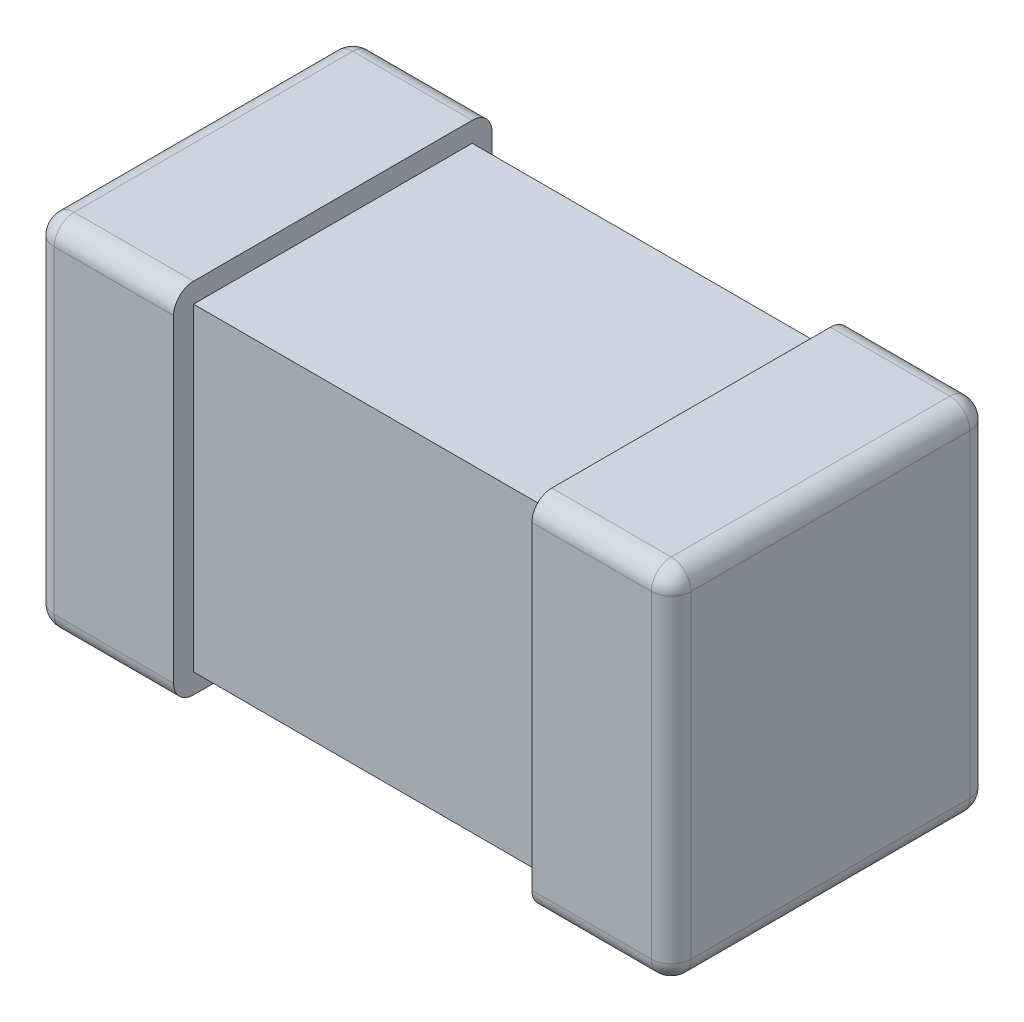
ISO-10303-21;
HEADER;
FILE_DESCRIPTION(('STEP AP214'),'2;1');
FILE_NAME('part.step','',(''),(''),'','','');
FILE_SCHEMA(('AUTOMOTIVE_DESIGN { 1 0 10303 214 1 1 1 1 }'));
ENDSEC;
DATA;
#1=APPLICATION_CONTEXT('core data for automotive mechanical design processes');
#2=APPLICATION_PROTOCOL_DEFINITION('international standard','automotive_design',2000,#1);
#3=PRODUCT_CONTEXT('',#1,'mechanical');
#4=PRODUCT('Part','Part','',(#3));
#5=PRODUCT_RELATED_PRODUCT_CATEGORY('part','',(#4));
#6=PRODUCT_DEFINITION_FORMATION('','',#4);
#7=PRODUCT_DEFINITION_CONTEXT('part definition',#1,'design');
#8=PRODUCT_DEFINITION('design','',#6,#7);
#9=PRODUCT_DEFINITION_SHAPE('','',#8);
#10=(LENGTH_UNIT() NAMED_UNIT(*) SI_UNIT(.MILLI.,.METRE.));
#11=(NAMED_UNIT(*) PLANE_ANGLE_UNIT() SI_UNIT($,.RADIAN.));
#12=(NAMED_UNIT(*) SI_UNIT($,.STERADIAN.) SOLID_ANGLE_UNIT());
#13=UNCERTAINTY_MEASURE_WITH_UNIT(LENGTH_MEASURE(1.E-05),#10,'distance_accuracy_value','');
#14=(GEOMETRIC_REPRESENTATION_CONTEXT(3) GLOBAL_UNCERTAINTY_ASSIGNED_CONTEXT((#13)) GLOBAL_UNIT_ASSIGNED_CONTEXT((#10,
#11,#12)) REPRESENTATION_CONTEXT('',''));
#15=CARTESIAN_POINT('',(0.,0.,0.));
#16=DIRECTION('',(0.,0.,1.));
#17=DIRECTION('',(1.,0.,0.));
#18=AXIS2_PLACEMENT_3D('',#15,#16,#17);
#19=CARTESIAN_POINT('',(-0.8,0.9,-0.4));
#20=DIRECTION('',(1.,0.,0.));
#21=DIRECTION('',(0.,0.,-1.));
#22=AXIS2_PLACEMENT_3D('',#19,#20,#21);
#23=PLANE('',#22);
#24=DIRECTION('',(0.,-1.,0.));
#25=VECTOR('',#24,1.);
#26=CARTESIAN_POINT('',(-0.8,0.9,-0.35));
#27=LINE('',#26,#25);
#28=CARTESIAN_POINT('',(-0.8,0.05,-0.35));
#29=VERTEX_POINT('',#28);
#30=CARTESIAN_POINT('',(-0.8,0.85,-0.35));
#31=VERTEX_POINT('',#30);
#32=EDGE_CURVE('E477',#29,#31,#27,.F.);
#33=ORIENTED_EDGE('',*,*,#32,.F.);
#34=DIRECTION('',(0.,0.,1.));
#35=VECTOR('',#34,1.);
#36=CARTESIAN_POINT('',(-0.8,0.05,-0.4));
#37=LINE('',#36,#35);
#38=CARTESIAN_POINT('',(-0.8,0.05,0.35));
#39=VERTEX_POINT('',#38);
#40=EDGE_CURVE('E476',#39,#29,#37,.F.);
#41=ORIENTED_EDGE('',*,*,#40,.F.);
#42=DIRECTION('',(0.,-1.,0.));
#43=VECTOR('',#42,1.);
#44=CARTESIAN_POINT('',(-0.8,0.9,0.35));
#45=LINE('',#44,#43);
#46=CARTESIAN_POINT('',(-0.8,0.85,0.35));
#47=VERTEX_POINT('',#46);
#48=EDGE_CURVE('E442',#47,#39,#45,.T.);
#49=ORIENTED_EDGE('',*,*,#48,.F.);
#50=DIRECTION('',(0.,0.,-1.));
#51=VECTOR('',#50,1.);
#52=CARTESIAN_POINT('',(-0.8,0.85,0.4));
#53=LINE('',#52,#51);
#54=EDGE_CURVE('E554',#31,#47,#53,.F.);
#55=ORIENTED_EDGE('',*,*,#54,.F.);
#56=EDGE_LOOP('',(#33,#41,#49,#55));
#57=FACE_BOUND('',#56,.T.);
#58=ADVANCED_FACE('F16',(#57),#23,.F.);
#59=CARTESIAN_POINT('',(0.8,0.9,-0.4));
#60=DIRECTION('',(-1.,0.,0.));
#61=DIRECTION('',(0.,0.,1.));
#62=AXIS2_PLACEMENT_3D('',#59,#60,#61);
#63=PLANE('',#62);
#64=DIRECTION('',(0.,-1.,0.));
#65=VECTOR('',#64,1.);
#66=CARTESIAN_POINT('',(0.8,0.9,0.35));
#67=LINE('',#66,#65);
#68=CARTESIAN_POINT('',(0.8,0.05,0.35));
#69=VERTEX_POINT('',#68);
#70=CARTESIAN_POINT('',(0.8,0.85,0.35));
#71=VERTEX_POINT('',#70);
#72=EDGE_CURVE('E375',#69,#71,#67,.F.);
#73=ORIENTED_EDGE('',*,*,#72,.F.);
#74=DIRECTION('',(0.,0.,-1.));
#75=VECTOR('',#74,1.);
#76=CARTESIAN_POINT('',(0.8,0.05,-0.4));
#77=LINE('',#76,#75);
#78=CARTESIAN_POINT('',(0.8,0.05,-0.35));
#79=VERTEX_POINT('',#78);
#80=EDGE_CURVE('E374',#79,#69,#77,.F.);
#81=ORIENTED_EDGE('',*,*,#80,.F.);
#82=DIRECTION('',(0.,-1.,0.));
#83=VECTOR('',#82,1.);
#84=CARTESIAN_POINT('',(0.8,0.9,-0.35));
#85=LINE('',#84,#83);
#86=CARTESIAN_POINT('',(0.8,0.85,-0.35));
#87=VERTEX_POINT('',#86);
#88=EDGE_CURVE('E336',#87,#79,#85,.T.);
#89=ORIENTED_EDGE('',*,*,#88,.F.);
#90=DIRECTION('',(0.,0.,1.));
#91=VECTOR('',#90,1.);
#92=CARTESIAN_POINT('',(0.8,0.85,0.400000000000001));
#93=LINE('',#92,#91);
#94=EDGE_CURVE('E532',#71,#87,#93,.F.);
#95=ORIENTED_EDGE('',*,*,#94,.F.);
#96=EDGE_LOOP('',(#73,#81,#89,#95));
#97=FACE_BOUND('',#96,.T.);
#98=ADVANCED_FACE('F509',(#97),#63,.F.);
#99=CARTESIAN_POINT('',(-0.75,0.85,0.35));
#100=DIRECTION('',(1.,0.,0.));
#101=DIRECTION('',(0.,0.,-1.));
#102=AXIS2_PLACEMENT_3D('',#99,#100,#101);
#103=SPHERICAL_SURFACE('',#102,0.05);
#104=CARTESIAN_POINT('',(-0.75,0.85,0.35));
#105=DIRECTION('',(-1.,0.,0.));
#106=DIRECTION('',(0.,0.,1.));
#107=AXIS2_PLACEMENT_3D('',#104,#105,#106);
#108=CIRCLE('',#107,0.05);
#109=CARTESIAN_POINT('',(-0.75,0.9,0.35));
#110=VERTEX_POINT('',#109);
#111=CARTESIAN_POINT('',(-0.75,0.85,0.4));
#112=VERTEX_POINT('',#111);
#113=EDGE_CURVE('E434',#110,#112,#108,.F.);
#114=ORIENTED_EDGE('',*,*,#113,.F.);
#115=CARTESIAN_POINT('',(-0.75,0.85,0.35));
#116=DIRECTION('',(0.,0.,-1.));
#117=DIRECTION('',(-1.,0.,0.));
#118=AXIS2_PLACEMENT_3D('',#115,#116,#117);
#119=CIRCLE('',#118,0.05);
#120=EDGE_CURVE('E557',#47,#110,#119,.T.);
#121=ORIENTED_EDGE('',*,*,#120,.F.);
#122=CARTESIAN_POINT('',(-0.75,0.85,0.35));
#123=DIRECTION('',(0.,-1.,0.));
#124=DIRECTION('',(0.,0.,-1.));
#125=AXIS2_PLACEMENT_3D('',#122,#123,#124);
#126=CIRCLE('',#125,0.05);
#127=EDGE_CURVE('E430',#112,#47,#126,.T.);
#128=ORIENTED_EDGE('',*,*,#127,.F.);
#129=EDGE_LOOP('',(#114,#121,#128));
#130=FACE_BOUND('',#129,.T.);
#131=ADVANCED_FACE('F505',(#130),#103,.T.);
#132=CARTESIAN_POINT('',(-0.75,0.85,0.4));
#133=DIRECTION('',(0.,0.,-1.));
#134=DIRECTION('',(-1.,0.,0.));
#135=AXIS2_PLACEMENT_3D('',#132,#133,#134);
#136=CYLINDRICAL_SURFACE('',#135,0.05);
#137=CARTESIAN_POINT('',(-0.75,0.85,-0.35));
#138=DIRECTION('',(0.,3.83299520255585E-12,1.));
#139=DIRECTION('',(1.,0.,0.));
#140=AXIS2_PLACEMENT_3D('',#137,#138,#139);
#141=CIRCLE('',#140,0.05);
#142=CARTESIAN_POINT('',(-0.75,0.9,-0.350000000000048));
#143=VERTEX_POINT('',#142);
#144=EDGE_CURVE('E483',#31,#143,#141,.F.);
#145=ORIENTED_EDGE('',*,*,#144,.F.);
#146=ORIENTED_EDGE('',*,*,#54,.T.);
#147=ORIENTED_EDGE('',*,*,#120,.T.);
#148=DIRECTION('',(0.,0.,1.));
#149=VECTOR('',#148,1.);
#150=CARTESIAN_POINT('',(-0.75,0.9,0.4));
#151=LINE('',#150,#149);
#152=EDGE_CURVE('E186',#143,#110,#151,.T.);
#153=ORIENTED_EDGE('',*,*,#152,.F.);
#154=EDGE_LOOP('',(#145,#146,#147,#153));
#155=FACE_BOUND('',#154,.T.);
#156=ADVANCED_FACE('F501',(#155),#136,.T.);
#157=CARTESIAN_POINT('',(-0.75,0.85,-0.35));
#158=DIRECTION('',(1.,0.,0.));
#159=DIRECTION('',(0.,0.,-1.));
#160=AXIS2_PLACEMENT_3D('',#157,#158,#159);
#161=SPHERICAL_SURFACE('',#160,0.05);
#162=CARTESIAN_POINT('',(-0.75,0.85,-0.35));
#163=DIRECTION('',(1.,0.,0.));
#164=DIRECTION('',(0.,0.,-1.));
#165=AXIS2_PLACEMENT_3D('',#162,#163,#164);
#166=CIRCLE('',#165,0.05);
#167=CARTESIAN_POINT('',(-0.75,0.85,-0.4));
#168=VERTEX_POINT('',#167);
#169=EDGE_CURVE('E190',#168,#143,#166,.T.);
#170=ORIENTED_EDGE('',*,*,#169,.F.);
#171=CARTESIAN_POINT('',(-0.75,0.85,-0.35));
#172=DIRECTION('',(0.,-1.,0.));
#173=DIRECTION('',(0.,0.,-1.));
#174=AXIS2_PLACEMENT_3D('',#171,#172,#173);
#175=CIRCLE('',#174,0.05);
#176=EDGE_CURVE('E480',#31,#168,#175,.T.);
#177=ORIENTED_EDGE('',*,*,#176,.F.);
#178=ORIENTED_EDGE('',*,*,#144,.T.);
#179=EDGE_LOOP('',(#170,#177,#178));
#180=FACE_BOUND('',#179,.T.);
#181=ADVANCED_FACE('F498',(#180),#161,.T.);
#182=CARTESIAN_POINT('',(-0.75,0.9,-0.35));
#183=DIRECTION('',(0.,-1.,0.));
#184=DIRECTION('',(0.,0.,-1.));
#185=AXIS2_PLACEMENT_3D('',#182,#183,#184);
#186=CYLINDRICAL_SURFACE('',#185,0.05);
#187=CARTESIAN_POINT('',(-0.75,0.05,-0.35));
#188=DIRECTION('',(0.,1.,0.));
#189=DIRECTION('',(1.,0.,0.));
#190=AXIS2_PLACEMENT_3D('',#187,#188,#189);
#191=CIRCLE('',#190,0.05);
#192=CARTESIAN_POINT('',(-0.75,0.05,-0.4));
#193=VERTEX_POINT('',#192);
#194=EDGE_CURVE('E473',#29,#193,#191,.F.);
#195=ORIENTED_EDGE('',*,*,#194,.F.);
#196=ORIENTED_EDGE('',*,*,#32,.T.);
#197=ORIENTED_EDGE('',*,*,#176,.T.);
#198=DIRECTION('',(0.,1.,0.));
#199=VECTOR('',#198,1.);
#200=CARTESIAN_POINT('',(-0.75,0.9,-0.4));
#201=LINE('',#200,#199);
#202=EDGE_CURVE('E304',#168,#193,#201,.F.);
#203=ORIENTED_EDGE('',*,*,#202,.T.);
#204=EDGE_LOOP('',(#195,#196,#197,#203));
#205=FACE_BOUND('',#204,.T.);
#206=ADVANCED_FACE('F465',(#205),#186,.T.);
#207=CARTESIAN_POINT('',(-0.75,0.05,-0.35));
#208=DIRECTION('',(1.,0.,0.));
#209=DIRECTION('',(0.,0.,-1.));
#210=AXIS2_PLACEMENT_3D('',#207,#208,#209);
#211=SPHERICAL_SURFACE('',#210,0.05);
#212=CARTESIAN_POINT('',(-0.75,0.05,-0.35));
#213=DIRECTION('',(0.,0.,1.));
#214=DIRECTION('',(1.,0.,0.));
#215=AXIS2_PLACEMENT_3D('',#212,#213,#214);
#216=CIRCLE('',#215,0.05);
#217=CARTESIAN_POINT('',(-0.75,0.,-0.35));
#218=VERTEX_POINT('',#217);
#219=EDGE_CURVE('E546',#29,#218,#216,.T.);
#220=ORIENTED_EDGE('',*,*,#219,.F.);
#221=ORIENTED_EDGE('',*,*,#194,.T.);
#222=CARTESIAN_POINT('',(-0.75,0.05,-0.35));
#223=DIRECTION('',(-1.,0.,0.));
#224=DIRECTION('',(0.,0.,1.));
#225=AXIS2_PLACEMENT_3D('',#222,#223,#224);
#226=CIRCLE('',#225,0.05);
#227=EDGE_CURVE('E297',#218,#193,#226,.F.);
#228=ORIENTED_EDGE('',*,*,#227,.F.);
#229=EDGE_LOOP('',(#220,#221,#228));
#230=FACE_BOUND('',#229,.T.);
#231=ADVANCED_FACE('F460',(#230),#211,.T.);
#232=CARTESIAN_POINT('',(-0.75,0.05,-0.4));
#233=DIRECTION('',(0.,0.,1.));
#234=DIRECTION('',(1.,0.,0.));
#235=AXIS2_PLACEMENT_3D('',#232,#233,#234);
#236=CYLINDRICAL_SURFACE('',#235,0.05);
#237=ORIENTED_EDGE('',*,*,#219,.T.);
#238=DIRECTION('',(0.,0.,1.));
#239=VECTOR('',#238,1.);
#240=CARTESIAN_POINT('',(-0.75,0.,0.4));
#241=LINE('',#240,#239);
#242=CARTESIAN_POINT('',(-0.75,0.,0.35));
#243=VERTEX_POINT('',#242);
#244=EDGE_CURVE('E291',#218,#243,#241,.T.);
#245=ORIENTED_EDGE('',*,*,#244,.T.);
#246=CARTESIAN_POINT('',(-0.75,0.05,0.35));
#247=DIRECTION('',(0.,0.,-1.));
#248=DIRECTION('',(1.,0.,0.));
#249=AXIS2_PLACEMENT_3D('',#246,#247,#248);
#250=CIRCLE('',#249,0.05);
#251=EDGE_CURVE('E431',#39,#243,#250,.F.);
#252=ORIENTED_EDGE('',*,*,#251,.F.);
#253=ORIENTED_EDGE('',*,*,#40,.T.);
#254=EDGE_LOOP('',(#237,#245,#252,#253));
#255=FACE_BOUND('',#254,.T.);
#256=ADVANCED_FACE('F456',(#255),#236,.T.);
#257=CARTESIAN_POINT('',(-0.75,0.05,0.35));
#258=DIRECTION('',(1.,0.,0.));
#259=DIRECTION('',(0.,0.,-1.));
#260=AXIS2_PLACEMENT_3D('',#257,#258,#259);
#261=SPHERICAL_SURFACE('',#260,0.05);
#262=CARTESIAN_POINT('',(-0.75,0.05,0.35));
#263=DIRECTION('',(0.,-1.,0.));
#264=DIRECTION('',(0.,0.,-1.));
#265=AXIS2_PLACEMENT_3D('',#262,#263,#264);
#266=CIRCLE('',#265,0.05);
#267=CARTESIAN_POINT('',(-0.75,0.05,0.4));
#268=VERTEX_POINT('',#267);
#269=EDGE_CURVE('E427',#39,#268,#266,.F.);
#270=ORIENTED_EDGE('',*,*,#269,.F.);
#271=ORIENTED_EDGE('',*,*,#251,.T.);
#272=CARTESIAN_POINT('',(-0.75,0.05,0.35));
#273=DIRECTION('',(1.,0.,0.));
#274=DIRECTION('',(0.,0.,-1.));
#275=AXIS2_PLACEMENT_3D('',#272,#273,#274);
#276=CIRCLE('',#275,0.05);
#277=EDGE_CURVE('E284',#268,#243,#276,.T.);
#278=ORIENTED_EDGE('',*,*,#277,.F.);
#279=EDGE_LOOP('',(#270,#271,#278));
#280=FACE_BOUND('',#279,.T.);
#281=ADVANCED_FACE('F453',(#280),#261,.T.);
#282=CARTESIAN_POINT('',(-0.75,0.9,0.35));
#283=DIRECTION('',(0.,-1.,0.));
#284=DIRECTION('',(0.,0.,-1.));
#285=AXIS2_PLACEMENT_3D('',#282,#283,#284);
#286=CYLINDRICAL_SURFACE('',#285,0.05);
#287=ORIENTED_EDGE('',*,*,#127,.T.);
#288=ORIENTED_EDGE('',*,*,#48,.T.);
#289=ORIENTED_EDGE('',*,*,#269,.T.);
#290=DIRECTION('',(0.,1.,0.));
#291=VECTOR('',#290,1.);
#292=CARTESIAN_POINT('',(-0.75,0.9,0.4));
#293=LINE('',#292,#291);
#294=EDGE_CURVE('E274',#268,#112,#293,.T.);
#295=ORIENTED_EDGE('',*,*,#294,.T.);
#296=EDGE_LOOP('',(#287,#288,#289,#295));
#297=FACE_BOUND('',#296,.T.);
#298=ADVANCED_FACE('F409',(#297),#286,.T.);
#299=CARTESIAN_POINT('',(0.75,0.85,-0.35));
#300=DIRECTION('',(1.,0.,0.));
#301=DIRECTION('',(0.,0.,-1.));
#302=AXIS2_PLACEMENT_3D('',#299,#300,#301);
#303=SPHERICAL_SURFACE('',#302,0.05);
#304=CARTESIAN_POINT('',(0.75,0.85,-0.35));
#305=DIRECTION('',(1.,0.,0.));
#306=DIRECTION('',(0.,0.,-1.));
#307=AXIS2_PLACEMENT_3D('',#304,#305,#306);
#308=CIRCLE('',#307,0.05);
#309=CARTESIAN_POINT('',(0.75,0.9,-0.35));
#310=VERTEX_POINT('',#309);
#311=CARTESIAN_POINT('',(0.75,0.85,-0.4));
#312=VERTEX_POINT('',#311);
#313=EDGE_CURVE('E328',#310,#312,#308,.F.);
#314=ORIENTED_EDGE('',*,*,#313,.F.);
#315=CARTESIAN_POINT('',(0.75,0.85,-0.35));
#316=DIRECTION('',(0.,0.,1.));
#317=DIRECTION('',(1.,0.,0.));
#318=AXIS2_PLACEMENT_3D('',#315,#316,#317);
#319=CIRCLE('',#318,0.05);
#320=EDGE_CURVE('E535',#87,#310,#319,.T.);
#321=ORIENTED_EDGE('',*,*,#320,.F.);
#322=CARTESIAN_POINT('',(0.75,0.85,-0.35));
#323=DIRECTION('',(0.,-1.,0.));
#324=DIRECTION('',(0.,0.,-1.));
#325=AXIS2_PLACEMENT_3D('',#322,#323,#324);
#326=CIRCLE('',#325,0.05);
#327=EDGE_CURVE('E324',#312,#87,#326,.T.);
#328=ORIENTED_EDGE('',*,*,#327,.F.);
#329=EDGE_LOOP('',(#314,#321,#328));
#330=FACE_BOUND('',#329,.T.);
#331=ADVANCED_FACE('F404',(#330),#303,.T.);
#332=CARTESIAN_POINT('',(0.75,0.85,0.400000000000001));
#333=DIRECTION('',(0.,0.,1.));
#334=DIRECTION('',(1.,0.,0.));
#335=AXIS2_PLACEMENT_3D('',#332,#333,#334);
#336=CYLINDRICAL_SURFACE('',#335,0.05);
#337=CARTESIAN_POINT('',(0.75,0.85,0.35));
#338=DIRECTION('',(0.,-3.83309478248086E-12,1.));
#339=DIRECTION('',(1.,0.,0.));
#340=AXIS2_PLACEMENT_3D('',#337,#338,#339);
#341=CIRCLE('',#340,0.05);
#342=CARTESIAN_POINT('',(0.75,0.9,0.350000000000048));
#343=VERTEX_POINT('',#342);
#344=EDGE_CURVE('E381',#71,#343,#341,.T.);
#345=ORIENTED_EDGE('',*,*,#344,.F.);
#346=ORIENTED_EDGE('',*,*,#94,.T.);
#347=ORIENTED_EDGE('',*,*,#320,.T.);
#348=DIRECTION('',(0.,0.,1.));
#349=VECTOR('',#348,1.);
#350=CARTESIAN_POINT('',(0.75,0.9,0.4));
#351=LINE('',#350,#349);
#352=EDGE_CURVE('E267',#343,#310,#351,.F.);
#353=ORIENTED_EDGE('',*,*,#352,.F.);
#354=EDGE_LOOP('',(#345,#346,#347,#353));
#355=FACE_BOUND('',#354,.T.);
#356=ADVANCED_FACE('F400',(#355),#336,.T.);
#357=CARTESIAN_POINT('',(0.75,0.85,0.35));
#358=DIRECTION('',(1.,0.,0.));
#359=DIRECTION('',(0.,0.,-1.));
#360=AXIS2_PLACEMENT_3D('',#357,#358,#359);
#361=SPHERICAL_SURFACE('',#360,0.05);
#362=CARTESIAN_POINT('',(0.75,0.85,0.35));
#363=DIRECTION('',(-1.,0.,0.));
#364=DIRECTION('',(0.,0.,1.));
#365=AXIS2_PLACEMENT_3D('',#362,#363,#364);
#366=CIRCLE('',#365,0.05);
#367=CARTESIAN_POINT('',(0.75,0.85,0.4));
#368=VERTEX_POINT('',#367);
#369=EDGE_CURVE('E261',#368,#343,#366,.T.);
#370=ORIENTED_EDGE('',*,*,#369,.F.);
#371=CARTESIAN_POINT('',(0.75,0.85,0.35));
#372=DIRECTION('',(0.,-1.,0.));
#373=DIRECTION('',(0.,0.,-1.));
#374=AXIS2_PLACEMENT_3D('',#371,#372,#373);
#375=CIRCLE('',#374,0.05);
#376=EDGE_CURVE('E378',#71,#368,#375,.T.);
#377=ORIENTED_EDGE('',*,*,#376,.F.);
#378=ORIENTED_EDGE('',*,*,#344,.T.);
#379=EDGE_LOOP('',(#370,#377,#378));
#380=FACE_BOUND('',#379,.T.);
#381=ADVANCED_FACE('F397',(#380),#361,.T.);
#382=CARTESIAN_POINT('',(0.75,0.9,0.35));
#383=DIRECTION('',(0.,-1.,0.));
#384=DIRECTION('',(0.,0.,-1.));
#385=AXIS2_PLACEMENT_3D('',#382,#383,#384);
#386=CYLINDRICAL_SURFACE('',#385,0.05);
#387=CARTESIAN_POINT('',(0.75,0.05,0.35));
#388=DIRECTION('',(0.,-1.,1.43719514775472E-12));
#389=DIRECTION('',(1.,0.,0.));
#390=AXIS2_PLACEMENT_3D('',#387,#388,#389);
#391=CIRCLE('',#390,0.05);
#392=CARTESIAN_POINT('',(0.75,0.050000000000018,0.4));
#393=VERTEX_POINT('',#392);
#394=EDGE_CURVE('E371',#69,#393,#391,.T.);
#395=ORIENTED_EDGE('',*,*,#394,.F.);
#396=ORIENTED_EDGE('',*,*,#72,.T.);
#397=ORIENTED_EDGE('',*,*,#376,.T.);
#398=DIRECTION('',(0.,1.,0.));
#399=VECTOR('',#398,1.);
#400=CARTESIAN_POINT('',(0.75,0.9,0.4));
#401=LINE('',#400,#399);
#402=EDGE_CURVE('E255',#368,#393,#401,.F.);
#403=ORIENTED_EDGE('',*,*,#402,.T.);
#404=EDGE_LOOP('',(#395,#396,#397,#403));
#405=FACE_BOUND('',#404,.T.);
#406=ADVANCED_FACE('F363',(#405),#386,.T.);
#407=CARTESIAN_POINT('',(0.75,0.05,0.35));
#408=DIRECTION('',(1.,0.,0.));
#409=DIRECTION('',(0.,0.,-1.));
#410=AXIS2_PLACEMENT_3D('',#407,#408,#409);
#411=SPHERICAL_SURFACE('',#410,0.05);
#412=CARTESIAN_POINT('',(0.75,0.05,0.35));
#413=DIRECTION('',(0.,0.,-1.));
#414=DIRECTION('',(-1.,0.,0.));
#415=AXIS2_PLACEMENT_3D('',#412,#413,#414);
#416=CIRCLE('',#415,0.05);
#417=CARTESIAN_POINT('',(0.75,0.,0.35));
#418=VERTEX_POINT('',#417);
#419=EDGE_CURVE('E524',#69,#418,#416,.T.);
#420=ORIENTED_EDGE('',*,*,#419,.F.);
#421=ORIENTED_EDGE('',*,*,#394,.T.);
#422=CARTESIAN_POINT('',(0.75,0.05,0.35));
#423=DIRECTION('',(1.,0.,0.));
#424=DIRECTION('',(0.,0.,-1.));
#425=AXIS2_PLACEMENT_3D('',#422,#423,#424);
#426=CIRCLE('',#425,0.05);
#427=EDGE_CURVE('E248',#418,#393,#426,.F.);
#428=ORIENTED_EDGE('',*,*,#427,.F.);
#429=EDGE_LOOP('',(#420,#421,#428));
#430=FACE_BOUND('',#429,.T.);
#431=ADVANCED_FACE('F358',(#430),#411,.T.);
#432=CARTESIAN_POINT('',(0.75,0.05,-0.4));
#433=DIRECTION('',(0.,0.,-1.));
#434=DIRECTION('',(-1.,0.,0.));
#435=AXIS2_PLACEMENT_3D('',#432,#433,#434);
#436=CYLINDRICAL_SURFACE('',#435,0.05);
#437=ORIENTED_EDGE('',*,*,#419,.T.);
#438=DIRECTION('',(0.,0.,1.));
#439=VECTOR('',#438,1.);
#440=CARTESIAN_POINT('',(0.75,0.,0.4));
#441=LINE('',#440,#439);
#442=CARTESIAN_POINT('',(0.75,0.,-0.35));
#443=VERTEX_POINT('',#442);
#444=EDGE_CURVE('E242',#418,#443,#441,.F.);
#445=ORIENTED_EDGE('',*,*,#444,.T.);
#446=CARTESIAN_POINT('',(0.75,0.05,-0.35));
#447=DIRECTION('',(0.,0.,-1.));
#448=DIRECTION('',(1.,0.,0.));
#449=AXIS2_PLACEMENT_3D('',#446,#447,#448);
#450=CIRCLE('',#449,0.05);
#451=EDGE_CURVE('E325',#79,#443,#450,.T.);
#452=ORIENTED_EDGE('',*,*,#451,.F.);
#453=ORIENTED_EDGE('',*,*,#80,.T.);
#454=EDGE_LOOP('',(#437,#445,#452,#453));
#455=FACE_BOUND('',#454,.T.);
#456=ADVANCED_FACE('F353',(#455),#436,.T.);
#457=CARTESIAN_POINT('',(0.75,0.05,-0.35));
#458=DIRECTION('',(1.,0.,0.));
#459=DIRECTION('',(0.,0.,-1.));
#460=AXIS2_PLACEMENT_3D('',#457,#458,#459);
#461=SPHERICAL_SURFACE('',#460,0.05);
#462=CARTESIAN_POINT('',(0.75,0.05,-0.35));
#463=DIRECTION('',(0.,-1.,0.));
#464=DIRECTION('',(0.,0.,-1.));
#465=AXIS2_PLACEMENT_3D('',#462,#463,#464);
#466=CIRCLE('',#465,0.05);
#467=CARTESIAN_POINT('',(0.75,0.05,-0.4));
#468=VERTEX_POINT('',#467);
#469=EDGE_CURVE('E321',#79,#468,#466,.F.);
#470=ORIENTED_EDGE('',*,*,#469,.F.);
#471=ORIENTED_EDGE('',*,*,#451,.T.);
#472=CARTESIAN_POINT('',(0.75,0.05,-0.35));
#473=DIRECTION('',(-1.,0.,0.));
#474=DIRECTION('',(0.,0.,1.));
#475=AXIS2_PLACEMENT_3D('',#472,#473,#474);
#476=CIRCLE('',#475,0.05);
#477=EDGE_CURVE('E235',#468,#443,#476,.T.);
#478=ORIENTED_EDGE('',*,*,#477,.F.);
#479=EDGE_LOOP('',(#470,#471,#478));
#480=FACE_BOUND('',#479,.T.);
#481=ADVANCED_FACE('F348',(#480),#461,.T.);
#482=CARTESIAN_POINT('',(0.75,0.9,-0.35));
#483=DIRECTION('',(0.,-1.,0.));
#484=DIRECTION('',(0.,0.,-1.));
#485=AXIS2_PLACEMENT_3D('',#482,#483,#484);
#486=CYLINDRICAL_SURFACE('',#485,0.05);
#487=ORIENTED_EDGE('',*,*,#327,.T.);
#488=ORIENTED_EDGE('',*,*,#88,.T.);
#489=ORIENTED_EDGE('',*,*,#469,.T.);
#490=DIRECTION('',(0.,1.,0.));
#491=VECTOR('',#490,1.);
#492=CARTESIAN_POINT('',(0.75,0.9,-0.4));
#493=LINE('',#492,#491);
#494=EDGE_CURVE('E210',#468,#312,#493,.T.);
#495=ORIENTED_EDGE('',*,*,#494,.T.);
#496=EDGE_LOOP('',(#487,#488,#489,#495));
#497=FACE_BOUND('',#496,.T.);
#498=ADVANCED_FACE('F352',(#497),#486,.T.);
#499=CARTESIAN_POINT('',(-0.8,0.85,0.35));
#500=DIRECTION('',(-1.,0.,0.));
#501=DIRECTION('',(0.,0.,1.));
#502=AXIS2_PLACEMENT_3D('',#499,#500,#501);
#503=CYLINDRICAL_SURFACE('',#502,0.05);
#504=ORIENTED_EDGE('',*,*,#113,.T.);
#505=DIRECTION('',(-1.,0.,0.));
#506=VECTOR('',#505,1.);
#507=CARTESIAN_POINT('',(-0.8,0.85,0.4));
#508=LINE('',#507,#506);
#509=CARTESIAN_POINT('',(-0.45,0.85,0.4));
#510=VERTEX_POINT('',#509);
#511=EDGE_CURVE('E203',#112,#510,#508,.F.);
#512=ORIENTED_EDGE('',*,*,#511,.T.);
#513=CARTESIAN_POINT('',(-0.45,0.85,0.35));
#514=DIRECTION('',(-1.,0.,0.));
#515=DIRECTION('',(0.,0.,1.));
#516=AXIS2_PLACEMENT_3D('',#513,#514,#515);
#517=CIRCLE('',#516,0.05);
#518=CARTESIAN_POINT('',(-0.45,0.9,0.35));
#519=VERTEX_POINT('',#518);
#520=EDGE_CURVE('E19',#510,#519,#517,.T.);
#521=ORIENTED_EDGE('',*,*,#520,.T.);
#522=DIRECTION('',(1.,0.,0.));
#523=VECTOR('',#522,1.);
#524=CARTESIAN_POINT('',(-0.8,0.9,0.35));
#525=LINE('',#524,#523);
#526=EDGE_CURVE('E181',#110,#519,#525,.T.);
#527=ORIENTED_EDGE('',*,*,#526,.F.);
#528=EDGE_LOOP('',(#504,#512,#521,#527));
#529=FACE_BOUND('',#528,.T.);
#530=ADVANCED_FACE('F201',(#529),#503,.T.);
#531=CARTESIAN_POINT('',(-0.8,0.9,0.4));
#532=DIRECTION('',(0.,1.,0.));
#533=DIRECTION('',(0.,0.,1.));
#534=AXIS2_PLACEMENT_3D('',#531,#532,#533);
#535=PLANE('',#534);
#536=DIRECTION('',(0.,0.,1.));
#537=VECTOR('',#536,1.);
#538=CARTESIAN_POINT('',(-0.45,0.9,-0.4));
#539=LINE('',#538,#537);
#540=CARTESIAN_POINT('',(-0.45,0.9,-0.35));
#541=VERTEX_POINT('',#540);
#542=EDGE_CURVE('E184',#519,#541,#539,.F.);
#543=ORIENTED_EDGE('',*,*,#542,.T.);
#544=DIRECTION('',(1.,0.,0.));
#545=VECTOR('',#544,1.);
#546=CARTESIAN_POINT('',(-0.8,0.9,-0.35));
#547=LINE('',#546,#545);
#548=EDGE_CURVE('E305',#143,#541,#547,.T.);
#549=ORIENTED_EDGE('',*,*,#548,.F.);
#550=ORIENTED_EDGE('',*,*,#152,.T.);
#551=ORIENTED_EDGE('',*,*,#526,.T.);
#552=EDGE_LOOP('',(#543,#549,#550,#551));
#553=FACE_BOUND('',#552,.T.);
#554=ADVANCED_FACE('F182',(#553),#535,.T.);
#555=CARTESIAN_POINT('',(-0.8,0.85,-0.35));
#556=DIRECTION('',(1.,0.,0.));
#557=DIRECTION('',(0.,0.,-1.));
#558=AXIS2_PLACEMENT_3D('',#555,#556,#557);
#559=CYLINDRICAL_SURFACE('',#558,0.05);
#560=ORIENTED_EDGE('',*,*,#169,.T.);
#561=ORIENTED_EDGE('',*,*,#548,.T.);
#562=CARTESIAN_POINT('',(-0.45,0.85,-0.35));
#563=DIRECTION('',(1.,0.,0.));
#564=DIRECTION('',(0.,0.,-1.));
#565=AXIS2_PLACEMENT_3D('',#562,#563,#564);
#566=CIRCLE('',#565,0.05);
#567=CARTESIAN_POINT('',(-0.45,0.85,-0.4));
#568=VERTEX_POINT('',#567);
#569=EDGE_CURVE('E198',#541,#568,#566,.F.);
#570=ORIENTED_EDGE('',*,*,#569,.T.);
#571=DIRECTION('',(1.,0.,0.));
#572=VECTOR('',#571,1.);
#573=CARTESIAN_POINT('',(-0.8,0.85,-0.4));
#574=LINE('',#573,#572);
#575=EDGE_CURVE('E300',#568,#168,#574,.F.);
#576=ORIENTED_EDGE('',*,*,#575,.T.);
#577=EDGE_LOOP('',(#560,#561,#570,#576));
#578=FACE_BOUND('',#577,.T.);
#579=ADVANCED_FACE('F727',(#578),#559,.T.);
#580=CARTESIAN_POINT('',(-0.8,0.9,-0.4));
#581=DIRECTION('',(0.,0.,1.));
#582=DIRECTION('',(1.,0.,0.));
#583=AXIS2_PLACEMENT_3D('',#580,#581,#582);
#584=PLANE('',#583);
#585=ORIENTED_EDGE('',*,*,#575,.F.);
#586=DIRECTION('',(0.,1.,0.));
#587=VECTOR('',#586,1.);
#588=CARTESIAN_POINT('',(-0.45,0.,-0.4));
#589=LINE('',#588,#587);
#590=CARTESIAN_POINT('',(-0.45,0.05,-0.4));
#591=VERTEX_POINT('',#590);
#592=EDGE_CURVE('E590',#568,#591,#589,.F.);
#593=ORIENTED_EDGE('',*,*,#592,.T.);
#594=DIRECTION('',(-1.,0.,0.));
#595=VECTOR('',#594,1.);
#596=CARTESIAN_POINT('',(-0.8,0.05,-0.4));
#597=LINE('',#596,#595);
#598=EDGE_CURVE('E292',#193,#591,#597,.F.);
#599=ORIENTED_EDGE('',*,*,#598,.F.);
#600=ORIENTED_EDGE('',*,*,#202,.F.);
#601=EDGE_LOOP('',(#585,#593,#599,#600));
#602=FACE_BOUND('',#601,.T.);
#603=ADVANCED_FACE('F723',(#602),#584,.F.);
#604=CARTESIAN_POINT('',(-0.8,0.05,-0.35));
#605=DIRECTION('',(-1.,0.,0.));
#606=DIRECTION('',(0.,0.,1.));
#607=AXIS2_PLACEMENT_3D('',#604,#605,#606);
#608=CYLINDRICAL_SURFACE('',#607,0.05);
#609=ORIENTED_EDGE('',*,*,#227,.T.);
#610=ORIENTED_EDGE('',*,*,#598,.T.);
#611=CARTESIAN_POINT('',(-0.45,0.05,-0.35));
#612=DIRECTION('',(-1.,0.,0.));
#613=DIRECTION('',(0.,0.,1.));
#614=AXIS2_PLACEMENT_3D('',#611,#612,#613);
#615=CIRCLE('',#614,0.05);
#616=CARTESIAN_POINT('',(-0.45,0.,-0.35));
#617=VERTEX_POINT('',#616);
#618=EDGE_CURVE('E587',#591,#617,#615,.T.);
#619=ORIENTED_EDGE('',*,*,#618,.T.);
#620=DIRECTION('',(1.,0.,0.));
#621=VECTOR('',#620,1.);
#622=CARTESIAN_POINT('',(-0.8,0.,-0.35));
#623=LINE('',#622,#621);
#624=EDGE_CURVE('E287',#617,#218,#623,.F.);
#625=ORIENTED_EDGE('',*,*,#624,.T.);
#626=EDGE_LOOP('',(#609,#610,#619,#625));
#627=FACE_BOUND('',#626,.T.);
#628=ADVANCED_FACE('F719',(#627),#608,.T.);
#629=CARTESIAN_POINT('',(-0.8,0.,0.4));
#630=DIRECTION('',(0.,1.,0.));
#631=DIRECTION('',(0.,0.,1.));
#632=AXIS2_PLACEMENT_3D('',#629,#630,#631);
#633=PLANE('',#632);
#634=DIRECTION('',(1.,0.,0.));
#635=VECTOR('',#634,1.);
#636=CARTESIAN_POINT('',(-0.8,0.,0.35));
#637=LINE('',#636,#635);
#638=CARTESIAN_POINT('',(-0.45,0.,0.35));
#639=VERTEX_POINT('',#638);
#640=EDGE_CURVE('E279',#243,#639,#637,.T.);
#641=ORIENTED_EDGE('',*,*,#640,.F.);
#642=ORIENTED_EDGE('',*,*,#244,.F.);
#643=ORIENTED_EDGE('',*,*,#624,.F.);
#644=DIRECTION('',(0.,0.,1.));
#645=VECTOR('',#644,1.);
#646=CARTESIAN_POINT('',(-0.45,0.,-0.4));
#647=LINE('',#646,#645);
#648=EDGE_CURVE('E586',#617,#639,#647,.T.);
#649=ORIENTED_EDGE('',*,*,#648,.T.);
#650=EDGE_LOOP('',(#641,#642,#643,#649));
#651=FACE_BOUND('',#650,.T.);
#652=ADVANCED_FACE('F715',(#651),#633,.F.);
#653=CARTESIAN_POINT('',(-0.8,0.05,0.35));
#654=DIRECTION('',(1.,0.,0.));
#655=DIRECTION('',(0.,0.,-1.));
#656=AXIS2_PLACEMENT_3D('',#653,#654,#655);
#657=CYLINDRICAL_SURFACE('',#656,0.05);
#658=ORIENTED_EDGE('',*,*,#277,.T.);
#659=ORIENTED_EDGE('',*,*,#640,.T.);
#660=CARTESIAN_POINT('',(-0.45,0.05,0.35));
#661=DIRECTION('',(1.,0.,0.));
#662=DIRECTION('',(0.,0.,-1.));
#663=AXIS2_PLACEMENT_3D('',#660,#661,#662);
#664=CIRCLE('',#663,0.05);
#665=CARTESIAN_POINT('',(-0.45,0.05,0.4));
#666=VERTEX_POINT('',#665);
#667=EDGE_CURVE('E581',#639,#666,#664,.F.);
#668=ORIENTED_EDGE('',*,*,#667,.T.);
#669=DIRECTION('',(-1.,0.,0.));
#670=VECTOR('',#669,1.);
#671=CARTESIAN_POINT('',(-0.8,0.05,0.4));
#672=LINE('',#671,#670);
#673=EDGE_CURVE('E270',#666,#268,#672,.T.);
#674=ORIENTED_EDGE('',*,*,#673,.T.);
#675=EDGE_LOOP('',(#658,#659,#668,#674));
#676=FACE_BOUND('',#675,.T.);
#677=ADVANCED_FACE('F711',(#676),#657,.T.);
#678=CARTESIAN_POINT('',(-0.8,0.9,0.4));
#679=DIRECTION('',(0.,0.,-1.));
#680=DIRECTION('',(-1.,0.,0.));
#681=AXIS2_PLACEMENT_3D('',#678,#679,#680);
#682=PLANE('',#681);
#683=ORIENTED_EDGE('',*,*,#673,.F.);
#684=DIRECTION('',(0.,1.,0.));
#685=VECTOR('',#684,1.);
#686=CARTESIAN_POINT('',(-0.45,0.,0.4));
#687=LINE('',#686,#685);
#688=EDGE_CURVE('E585',#666,#510,#687,.T.);
#689=ORIENTED_EDGE('',*,*,#688,.T.);
#690=ORIENTED_EDGE('',*,*,#511,.F.);
#691=ORIENTED_EDGE('',*,*,#294,.F.);
#692=EDGE_LOOP('',(#683,#689,#690,#691));
#693=FACE_BOUND('',#692,.T.);
#694=ADVANCED_FACE('F707',(#693),#682,.F.);
#695=CARTESIAN_POINT('',(-0.8,0.85,-0.35));
#696=DIRECTION('',(1.,0.,0.));
#697=DIRECTION('',(0.,0.,-1.));
#698=AXIS2_PLACEMENT_3D('',#695,#696,#697);
#699=CYLINDRICAL_SURFACE('',#698,0.05);
#700=ORIENTED_EDGE('',*,*,#313,.T.);
#701=DIRECTION('',(1.,0.,0.));
#702=VECTOR('',#701,1.);
#703=CARTESIAN_POINT('',(-0.8,0.85,-0.4));
#704=LINE('',#703,#702);
#705=CARTESIAN_POINT('',(0.45,0.85,-0.4));
#706=VERTEX_POINT('',#705);
#707=EDGE_CURVE('E224',#312,#706,#704,.F.);
#708=ORIENTED_EDGE('',*,*,#707,.T.);
#709=CARTESIAN_POINT('',(0.45,0.85,-0.35));
#710=DIRECTION('',(1.,0.,0.));
#711=DIRECTION('',(0.,0.,-1.));
#712=AXIS2_PLACEMENT_3D('',#709,#710,#711);
#713=CIRCLE('',#712,0.05);
#714=CARTESIAN_POINT('',(0.45,0.9,-0.35));
#715=VERTEX_POINT('',#714);
#716=EDGE_CURVE('E576',#706,#715,#713,.T.);
#717=ORIENTED_EDGE('',*,*,#716,.T.);
#718=DIRECTION('',(1.,0.,0.));
#719=VECTOR('',#718,1.);
#720=CARTESIAN_POINT('',(-0.8,0.9,-0.35));
#721=LINE('',#720,#719);
#722=EDGE_CURVE('E264',#310,#715,#721,.F.);
#723=ORIENTED_EDGE('',*,*,#722,.F.);
#724=EDGE_LOOP('',(#700,#708,#717,#723));
#725=FACE_BOUND('',#724,.T.);
#726=ADVANCED_FACE('F703',(#725),#699,.T.);
#727=CARTESIAN_POINT('',(-0.8,0.9,0.4));
#728=DIRECTION('',(0.,1.,0.));
#729=DIRECTION('',(0.,0.,1.));
#730=AXIS2_PLACEMENT_3D('',#727,#728,#729);
#731=PLANE('',#730);
#732=DIRECTION('',(0.,0.,-1.));
#733=VECTOR('',#732,1.);
#734=CARTESIAN_POINT('',(0.45,0.9,-0.4));
#735=LINE('',#734,#733);
#736=CARTESIAN_POINT('',(0.45,0.9,0.35));
#737=VERTEX_POINT('',#736);
#738=EDGE_CURVE('E575',#715,#737,#735,.F.);
#739=ORIENTED_EDGE('',*,*,#738,.T.);
#740=DIRECTION('',(-1.,0.,0.));
#741=VECTOR('',#740,1.);
#742=CARTESIAN_POINT('',(-0.8,0.9,0.35));
#743=LINE('',#742,#741);
#744=EDGE_CURVE('E256',#343,#737,#743,.T.);
#745=ORIENTED_EDGE('',*,*,#744,.F.);
#746=ORIENTED_EDGE('',*,*,#352,.T.);
#747=ORIENTED_EDGE('',*,*,#722,.T.);
#748=EDGE_LOOP('',(#739,#745,#746,#747));
#749=FACE_BOUND('',#748,.T.);
#750=ADVANCED_FACE('F699',(#749),#731,.T.);
#751=CARTESIAN_POINT('',(-0.8,0.85,0.35));
#752=DIRECTION('',(-1.,0.,0.));
#753=DIRECTION('',(0.,0.,1.));
#754=AXIS2_PLACEMENT_3D('',#751,#752,#753);
#755=CYLINDRICAL_SURFACE('',#754,0.05);
#756=ORIENTED_EDGE('',*,*,#369,.T.);
#757=ORIENTED_EDGE('',*,*,#744,.T.);
#758=CARTESIAN_POINT('',(0.45,0.85,0.35));
#759=DIRECTION('',(-1.,0.,0.));
#760=DIRECTION('',(0.,0.,1.));
#761=AXIS2_PLACEMENT_3D('',#758,#759,#760);
#762=CIRCLE('',#761,0.05);
#763=CARTESIAN_POINT('',(0.45,0.85,0.4));
#764=VERTEX_POINT('',#763);
#765=EDGE_CURVE('E571',#737,#764,#762,.F.);
#766=ORIENTED_EDGE('',*,*,#765,.T.);
#767=DIRECTION('',(-1.,0.,0.));
#768=VECTOR('',#767,1.);
#769=CARTESIAN_POINT('',(-0.8,0.85,0.4));
#770=LINE('',#769,#768);
#771=EDGE_CURVE('E251',#764,#368,#770,.F.);
#772=ORIENTED_EDGE('',*,*,#771,.T.);
#773=EDGE_LOOP('',(#756,#757,#766,#772));
#774=FACE_BOUND('',#773,.T.);
#775=ADVANCED_FACE('F695',(#774),#755,.T.);
#776=CARTESIAN_POINT('',(-0.8,0.9,0.4));
#777=DIRECTION('',(0.,0.,-1.));
#778=DIRECTION('',(-1.,0.,0.));
#779=AXIS2_PLACEMENT_3D('',#776,#777,#778);
#780=PLANE('',#779);
#781=DIRECTION('',(1.,0.,0.));
#782=VECTOR('',#781,1.);
#783=CARTESIAN_POINT('',(-0.8,0.05,0.4));
#784=LINE('',#783,#782);
#785=CARTESIAN_POINT('',(0.45,0.05,0.4));
#786=VERTEX_POINT('',#785);
#787=EDGE_CURVE('E243',#393,#786,#784,.F.);
#788=ORIENTED_EDGE('',*,*,#787,.F.);
#789=ORIENTED_EDGE('',*,*,#402,.F.);
#790=ORIENTED_EDGE('',*,*,#771,.F.);
#791=DIRECTION('',(0.,1.,0.));
#792=VECTOR('',#791,1.);
#793=CARTESIAN_POINT('',(0.45,0.,0.4));
#794=LINE('',#793,#792);
#795=EDGE_CURVE('E570',#764,#786,#794,.F.);
#796=ORIENTED_EDGE('',*,*,#795,.T.);
#797=EDGE_LOOP('',(#788,#789,#790,#796));
#798=FACE_BOUND('',#797,.T.);
#799=ADVANCED_FACE('F691',(#798),#780,.F.);
#800=CARTESIAN_POINT('',(-0.8,0.05,0.35));
#801=DIRECTION('',(1.,0.,0.));
#802=DIRECTION('',(0.,0.,-1.));
#803=AXIS2_PLACEMENT_3D('',#800,#801,#802);
#804=CYLINDRICAL_SURFACE('',#803,0.05);
#805=ORIENTED_EDGE('',*,*,#427,.T.);
#806=ORIENTED_EDGE('',*,*,#787,.T.);
#807=CARTESIAN_POINT('',(0.45,0.05,0.35));
#808=DIRECTION('',(1.,0.,0.));
#809=DIRECTION('',(0.,0.,-1.));
#810=AXIS2_PLACEMENT_3D('',#807,#808,#809);
#811=CIRCLE('',#810,0.05);
#812=CARTESIAN_POINT('',(0.45,0.,0.35));
#813=VERTEX_POINT('',#812);
#814=EDGE_CURVE('E566',#786,#813,#811,.T.);
#815=ORIENTED_EDGE('',*,*,#814,.T.);
#816=DIRECTION('',(1.,0.,0.));
#817=VECTOR('',#816,1.);
#818=CARTESIAN_POINT('',(-0.8,0.,0.35));
#819=LINE('',#818,#817);
#820=EDGE_CURVE('E238',#813,#418,#819,.T.);
#821=ORIENTED_EDGE('',*,*,#820,.T.);
#822=EDGE_LOOP('',(#805,#806,#815,#821));
#823=FACE_BOUND('',#822,.T.);
#824=ADVANCED_FACE('F687',(#823),#804,.T.);
#825=CARTESIAN_POINT('',(-0.8,0.,0.4));
#826=DIRECTION('',(0.,1.,0.));
#827=DIRECTION('',(0.,0.,1.));
#828=AXIS2_PLACEMENT_3D('',#825,#826,#827);
#829=PLANE('',#828);
#830=DIRECTION('',(-1.,0.,0.));
#831=VECTOR('',#830,1.);
#832=CARTESIAN_POINT('',(-0.8,0.,-0.35));
#833=LINE('',#832,#831);
#834=CARTESIAN_POINT('',(0.45,0.,-0.35));
#835=VERTEX_POINT('',#834);
#836=EDGE_CURVE('E230',#443,#835,#833,.T.);
#837=ORIENTED_EDGE('',*,*,#836,.F.);
#838=ORIENTED_EDGE('',*,*,#444,.F.);
#839=ORIENTED_EDGE('',*,*,#820,.F.);
#840=DIRECTION('',(0.,0.,-1.));
#841=VECTOR('',#840,1.);
#842=CARTESIAN_POINT('',(0.45,0.,-0.4));
#843=LINE('',#842,#841);
#844=EDGE_CURVE('E565',#813,#835,#843,.T.);
#845=ORIENTED_EDGE('',*,*,#844,.T.);
#846=EDGE_LOOP('',(#837,#838,#839,#845));
#847=FACE_BOUND('',#846,.T.);
#848=ADVANCED_FACE('F683',(#847),#829,.F.);
#849=CARTESIAN_POINT('',(-0.8,0.05,-0.35));
#850=DIRECTION('',(-1.,0.,0.));
#851=DIRECTION('',(0.,0.,1.));
#852=AXIS2_PLACEMENT_3D('',#849,#850,#851);
#853=CYLINDRICAL_SURFACE('',#852,0.05);
#854=ORIENTED_EDGE('',*,*,#477,.T.);
#855=ORIENTED_EDGE('',*,*,#836,.T.);
#856=CARTESIAN_POINT('',(0.45,0.05,-0.35));
#857=DIRECTION('',(-1.,0.,0.));
#858=DIRECTION('',(0.,0.,1.));
#859=AXIS2_PLACEMENT_3D('',#856,#857,#858);
#860=CIRCLE('',#859,0.05);
#861=CARTESIAN_POINT('',(0.45,0.05,-0.4));
#862=VERTEX_POINT('',#861);
#863=EDGE_CURVE('E560',#835,#862,#860,.F.);
#864=ORIENTED_EDGE('',*,*,#863,.T.);
#865=DIRECTION('',(1.,0.,0.));
#866=VECTOR('',#865,1.);
#867=CARTESIAN_POINT('',(-0.8,0.05,-0.4));
#868=LINE('',#867,#866);
#869=EDGE_CURVE('E217',#862,#468,#868,.T.);
#870=ORIENTED_EDGE('',*,*,#869,.T.);
#871=EDGE_LOOP('',(#854,#855,#864,#870));
#872=FACE_BOUND('',#871,.T.);
#873=ADVANCED_FACE('F679',(#872),#853,.T.);
#874=CARTESIAN_POINT('',(-0.8,0.9,-0.4));
#875=DIRECTION('',(0.,0.,1.));
#876=DIRECTION('',(1.,0.,0.));
#877=AXIS2_PLACEMENT_3D('',#874,#875,#876);
#878=PLANE('',#877);
#879=ORIENTED_EDGE('',*,*,#869,.F.);
#880=DIRECTION('',(0.,1.,0.));
#881=VECTOR('',#880,1.);
#882=CARTESIAN_POINT('',(0.45,0.,-0.4));
#883=LINE('',#882,#881);
#884=EDGE_CURVE('E564',#862,#706,#883,.T.);
#885=ORIENTED_EDGE('',*,*,#884,.T.);
#886=ORIENTED_EDGE('',*,*,#707,.F.);
#887=ORIENTED_EDGE('',*,*,#494,.F.);
#888=EDGE_LOOP('',(#879,#885,#886,#887));
#889=FACE_BOUND('',#888,.T.);
#890=ADVANCED_FACE('F676',(#889),#878,.F.);
#891=CARTESIAN_POINT('',(0.45,-2.499999999996E-05,-0.35));
#892=DIRECTION('',(0.,0.,1.));
#893=DIRECTION('',(1.,0.,0.));
#894=AXIS2_PLACEMENT_3D('',#891,#892,#893);
#895=PLANE('',#894);
#896=DIRECTION('',(0.,1.,0.));
#897=VECTOR('',#896,1.);
#898=CARTESIAN_POINT('',(-0.45,0.,-0.35));
#899=LINE('',#898,#897);
#900=CARTESIAN_POINT('',(-0.45,0.05,-0.35));
#901=VERTEX_POINT('',#900);
#902=CARTESIAN_POINT('',(-0.45,0.85,-0.35));
#903=VERTEX_POINT('',#902);
#904=EDGE_CURVE('E206',#901,#903,#899,.T.);
#905=ORIENTED_EDGE('',*,*,#904,.T.);
#906=DIRECTION('',(1.,0.,0.));
#907=VECTOR('',#906,1.);
#908=CARTESIAN_POINT('',(-0.45,0.85,-0.35));
#909=LINE('',#908,#907);
#910=CARTESIAN_POINT('',(0.45,0.85,-0.35));
#911=VERTEX_POINT('',#910);
#912=EDGE_CURVE('E603',#911,#903,#909,.F.);
#913=ORIENTED_EDGE('',*,*,#912,.F.);
#914=DIRECTION('',(0.,1.,0.));
#915=VECTOR('',#914,1.);
#916=CARTESIAN_POINT('',(0.45,0.,-0.35));
#917=LINE('',#916,#915);
#918=CARTESIAN_POINT('',(0.45,0.05,-0.35));
#919=VERTEX_POINT('',#918);
#920=EDGE_CURVE('E624',#911,#919,#917,.F.);
#921=ORIENTED_EDGE('',*,*,#920,.T.);
#922=DIRECTION('',(1.,0.,0.));
#923=VECTOR('',#922,1.);
#924=CARTESIAN_POINT('',(-0.45,0.05,-0.35));
#925=LINE('',#924,#923);
#926=EDGE_CURVE('E628',#901,#919,#925,.T.);
#927=ORIENTED_EDGE('',*,*,#926,.F.);
#928=EDGE_LOOP('',(#905,#913,#921,#927));
#929=FACE_BOUND('',#928,.T.);
#930=ADVANCED_FACE('F673',(#929),#895,.F.);
#931=CARTESIAN_POINT('',(-0.45,0.,-0.4));
#932=DIRECTION('',(-1.,0.,0.));
#933=DIRECTION('',(0.,0.,1.));
#934=AXIS2_PLACEMENT_3D('',#931,#932,#933);
#935=PLANE('',#934);
#936=ORIENTED_EDGE('',*,*,#667,.F.);
#937=ORIENTED_EDGE('',*,*,#648,.F.);
#938=ORIENTED_EDGE('',*,*,#618,.F.);
#939=ORIENTED_EDGE('',*,*,#592,.F.);
#940=ORIENTED_EDGE('',*,*,#569,.F.);
#941=ORIENTED_EDGE('',*,*,#542,.F.);
#942=ORIENTED_EDGE('',*,*,#520,.F.);
#943=ORIENTED_EDGE('',*,*,#688,.F.);
#944=EDGE_LOOP('',(#936,#937,#938,#939,#940,#941,#942,#943));
#945=FACE_BOUND('',#944,.T.);
#946=DIRECTION('',(0.,0.,-1.));
#947=VECTOR('',#946,1.);
#948=CARTESIAN_POINT('',(-0.45,0.05,-1.60415945787923));
#949=LINE('',#948,#947);
#950=CARTESIAN_POINT('',(-0.45,0.05,0.35));
#951=VERTEX_POINT('',#950);
#952=EDGE_CURVE('E633',#951,#901,#949,.T.);
#953=ORIENTED_EDGE('',*,*,#952,.F.);
#954=DIRECTION('',(0.,1.,0.));
#955=VECTOR('',#954,1.);
#956=CARTESIAN_POINT('',(-0.45,-2.499999999996E-05,0.35));
#957=LINE('',#956,#955);
#958=CARTESIAN_POINT('',(-0.45,0.85,0.35));
#959=VERTEX_POINT('',#958);
#960=EDGE_CURVE('E637',#951,#959,#957,.T.);
#961=ORIENTED_EDGE('',*,*,#960,.T.);
#962=DIRECTION('',(0.,0.,1.));
#963=VECTOR('',#962,1.);
#964=CARTESIAN_POINT('',(-0.45,0.85,-1.60415945787923));
#965=LINE('',#964,#963);
#966=EDGE_CURVE('E580',#903,#959,#965,.T.);
#967=ORIENTED_EDGE('',*,*,#966,.F.);
#968=ORIENTED_EDGE('',*,*,#904,.F.);
#969=EDGE_LOOP('',(#953,#961,#967,#968));
#970=FACE_BOUND('',#969,.T.);
#971=ADVANCED_FACE('F194',(#945,#970),#935,.F.);
#972=CARTESIAN_POINT('',(-0.45,0.85,-1.60415945787923));
#973=DIRECTION('',(0.,1.,0.));
#974=DIRECTION('',(0.,0.,1.));
#975=AXIS2_PLACEMENT_3D('',#972,#973,#974);
#976=PLANE('',#975);
#977=DIRECTION('',(-1.,0.,0.));
#978=VECTOR('',#977,1.);
#979=CARTESIAN_POINT('',(-0.45,0.85,0.35));
#980=LINE('',#979,#978);
#981=CARTESIAN_POINT('',(0.45,0.85,0.35));
#982=VERTEX_POINT('',#981);
#983=EDGE_CURVE('E641',#959,#982,#980,.F.);
#984=ORIENTED_EDGE('',*,*,#983,.T.);
#985=DIRECTION('',(0.,0.,-1.));
#986=VECTOR('',#985,1.);
#987=CARTESIAN_POINT('',(0.45,0.85,-0.4));
#988=LINE('',#987,#986);
#989=EDGE_CURVE('E620',#982,#911,#988,.T.);
#990=ORIENTED_EDGE('',*,*,#989,.T.);
#991=ORIENTED_EDGE('',*,*,#912,.T.);
#992=ORIENTED_EDGE('',*,*,#966,.T.);
#993=EDGE_LOOP('',(#984,#990,#991,#992));
#994=FACE_BOUND('',#993,.T.);
#995=ADVANCED_FACE('F656',(#994),#976,.T.);
#996=CARTESIAN_POINT('',(0.45,0.,-0.4));
#997=DIRECTION('',(1.,0.,0.));
#998=DIRECTION('',(0.,0.,-1.));
#999=AXIS2_PLACEMENT_3D('',#996,#997,#998);
#1000=PLANE('',#999);
#1001=ORIENTED_EDGE('',*,*,#920,.F.);
#1002=ORIENTED_EDGE('',*,*,#989,.F.);
#1003=DIRECTION('',(0.,1.,0.));
#1004=VECTOR('',#1003,1.);
#1005=CARTESIAN_POINT('',(0.45,-2.499999999996E-05,0.35));
#1006=LINE('',#1005,#1004);
#1007=CARTESIAN_POINT('',(0.45,0.05,0.35));
#1008=VERTEX_POINT('',#1007);
#1009=EDGE_CURVE('E26',#982,#1008,#1006,.F.);
#1010=ORIENTED_EDGE('',*,*,#1009,.T.);
#1011=DIRECTION('',(0.,0.,-1.));
#1012=VECTOR('',#1011,1.);
#1013=CARTESIAN_POINT('',(0.45,0.05,-1.60415945787923));
#1014=LINE('',#1013,#1012);
#1015=EDGE_CURVE('E34',#919,#1008,#1014,.F.);
#1016=ORIENTED_EDGE('',*,*,#1015,.F.);
#1017=EDGE_LOOP('',(#1001,#1002,#1010,#1016));
#1018=FACE_BOUND('',#1017,.T.);
#1019=ORIENTED_EDGE('',*,*,#863,.F.);
#1020=ORIENTED_EDGE('',*,*,#844,.F.);
#1021=ORIENTED_EDGE('',*,*,#814,.F.);
#1022=ORIENTED_EDGE('',*,*,#795,.F.);
#1023=ORIENTED_EDGE('',*,*,#765,.F.);
#1024=ORIENTED_EDGE('',*,*,#738,.F.);
#1025=ORIENTED_EDGE('',*,*,#716,.F.);
#1026=ORIENTED_EDGE('',*,*,#884,.F.);
#1027=EDGE_LOOP('',(#1019,#1020,#1021,#1022,#1023,#1024,#1025,#1026));
#1028=FACE_BOUND('',#1027,.T.);
#1029=ADVANCED_FACE('F650',(#1018,#1028),#1000,.F.);
#1030=CARTESIAN_POINT('',(-0.45,0.05,-1.60415945787923));
#1031=DIRECTION('',(0.,-1.,0.));
#1032=DIRECTION('',(0.,0.,-1.));
#1033=AXIS2_PLACEMENT_3D('',#1030,#1031,#1032);
#1034=PLANE('',#1033);
#1035=DIRECTION('',(-1.,0.,0.));
#1036=VECTOR('',#1035,1.);
#1037=CARTESIAN_POINT('',(-0.45,0.05,0.35));
#1038=LINE('',#1037,#1036);
#1039=EDGE_CURVE('E11',#1008,#951,#1038,.T.);
#1040=ORIENTED_EDGE('',*,*,#1039,.T.);
#1041=ORIENTED_EDGE('',*,*,#952,.T.);
#1042=ORIENTED_EDGE('',*,*,#926,.T.);
#1043=ORIENTED_EDGE('',*,*,#1015,.T.);
#1044=EDGE_LOOP('',(#1040,#1041,#1042,#1043));
#1045=FACE_BOUND('',#1044,.T.);
#1046=ADVANCED_FACE('F658',(#1045),#1034,.T.);
#1047=CARTESIAN_POINT('',(-0.45,-2.499999999996E-05,0.35));
#1048=DIRECTION('',(0.,0.,-1.));
#1049=DIRECTION('',(-1.,0.,0.));
#1050=AXIS2_PLACEMENT_3D('',#1047,#1048,#1049);
#1051=PLANE('',#1050);
#1052=ORIENTED_EDGE('',*,*,#1009,.F.);
#1053=ORIENTED_EDGE('',*,*,#983,.F.);
#1054=ORIENTED_EDGE('',*,*,#960,.F.);
#1055=ORIENTED_EDGE('',*,*,#1039,.F.);
#1056=EDGE_LOOP('',(#1052,#1053,#1054,#1055));
#1057=FACE_BOUND('',#1056,.T.);
#1058=ADVANCED_FACE('F654',(#1057),#1051,.F.);
#1059=CLOSED_SHELL('',(#58,#98,#131,#156,#181,#206,#231,#256,#281,#298,#331,#356,#381,#406,#431,
#456,#481,#498,#530,#554,#579,#603,#628,#652,#677,#694,#726,#750,#775,#799,#824,#848,#873,#890,
#930,#971,#995,#1029,#1046,#1058));
#1060=MANIFOLD_SOLID_BREP('B1',#1059);
#1061=ADVANCED_BREP_SHAPE_REPRESENTATION('',(#18,#1060),#14);
#1062=SHAPE_DEFINITION_REPRESENTATION(#9,#1061);
ENDSEC;
END-ISO-10303-21;
